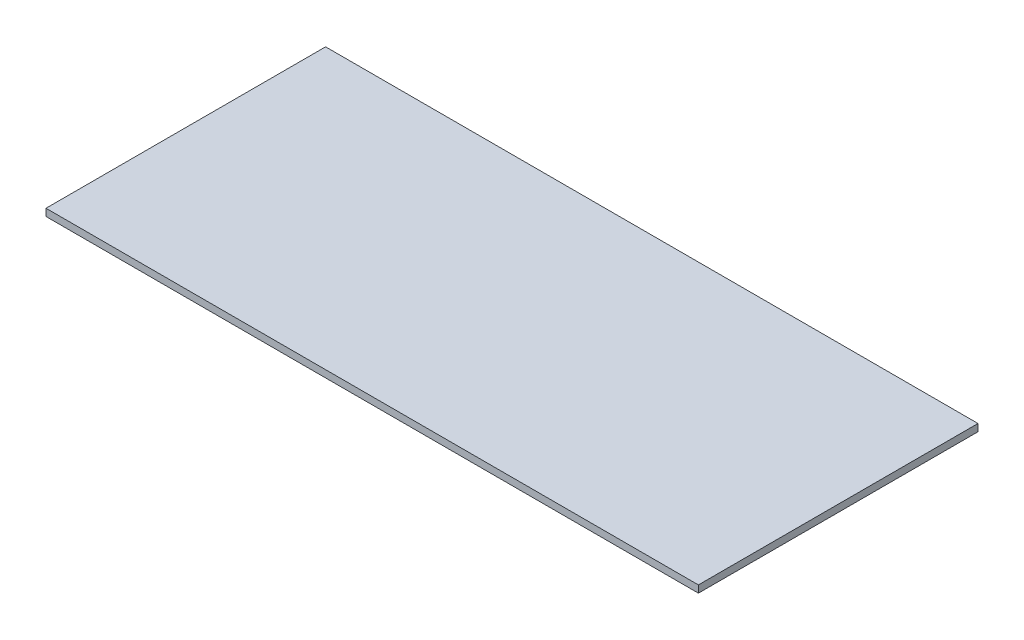
ISO-10303-21;
HEADER;
FILE_DESCRIPTION(('STEP AP214'),'2;1');
FILE_NAME('part.step','',(''),(''),'','','');
FILE_SCHEMA(('AUTOMOTIVE_DESIGN { 1 0 10303 214 1 1 1 1 }'));
ENDSEC;
DATA;
#1=APPLICATION_CONTEXT('core data for automotive mechanical design processes');
#2=APPLICATION_PROTOCOL_DEFINITION('international standard','automotive_design',2000,#1);
#3=PRODUCT_CONTEXT('',#1,'mechanical');
#4=PRODUCT('Part','Part','',(#3));
#5=PRODUCT_RELATED_PRODUCT_CATEGORY('part','',(#4));
#6=PRODUCT_DEFINITION_FORMATION('','',#4);
#7=PRODUCT_DEFINITION_CONTEXT('part definition',#1,'design');
#8=PRODUCT_DEFINITION('design','',#6,#7);
#9=PRODUCT_DEFINITION_SHAPE('','',#8);
#10=(LENGTH_UNIT() NAMED_UNIT(*) SI_UNIT(.MILLI.,.METRE.));
#11=(NAMED_UNIT(*) PLANE_ANGLE_UNIT() SI_UNIT($,.RADIAN.));
#12=(NAMED_UNIT(*) SI_UNIT($,.STERADIAN.) SOLID_ANGLE_UNIT());
#13=UNCERTAINTY_MEASURE_WITH_UNIT(LENGTH_MEASURE(1.E-05),#10,'distance_accuracy_value','');
#14=(GEOMETRIC_REPRESENTATION_CONTEXT(3) GLOBAL_UNCERTAINTY_ASSIGNED_CONTEXT((#13)) GLOBAL_UNIT_ASSIGNED_CONTEXT((#10,
#11,#12)) REPRESENTATION_CONTEXT('',''));
#15=CARTESIAN_POINT('',(0.,0.,0.));
#16=DIRECTION('',(0.,0.,1.));
#17=DIRECTION('',(1.,0.,0.));
#18=AXIS2_PLACEMENT_3D('',#15,#16,#17);
#19=CARTESIAN_POINT('',(0.,2.,0.));
#20=DIRECTION('',(1.,0.,0.));
#21=DIRECTION('',(0.,0.,-1.));
#22=AXIS2_PLACEMENT_3D('',#19,#20,#21);
#23=PLANE('',#22);
#24=DIRECTION('',(0.,0.,1.));
#25=VECTOR('',#24,1.);
#26=CARTESIAN_POINT('',(0.,0.,0.));
#27=LINE('',#26,#25);
#28=CARTESIAN_POINT('',(0.,0.,-78.));
#29=VERTEX_POINT('',#28);
#30=CARTESIAN_POINT('',(0.,0.,0.));
#31=VERTEX_POINT('',#30);
#32=EDGE_CURVE('E96',#29,#31,#27,.T.);
#33=ORIENTED_EDGE('',*,*,#32,.T.);
#34=DIRECTION('',(0.,-1.,0.));
#35=VECTOR('',#34,1.);
#36=CARTESIAN_POINT('',(0.,2.,0.));
#37=LINE('',#36,#35);
#38=CARTESIAN_POINT('',(0.,2.,0.));
#39=VERTEX_POINT('',#38);
#40=EDGE_CURVE('E11',#39,#31,#37,.T.);
#41=ORIENTED_EDGE('',*,*,#40,.F.);
#42=DIRECTION('',(0.,0.,1.));
#43=VECTOR('',#42,1.);
#44=CARTESIAN_POINT('',(0.,2.,0.));
#45=LINE('',#44,#43);
#46=CARTESIAN_POINT('',(0.,2.,-78.));
#47=VERTEX_POINT('',#46);
#48=EDGE_CURVE('E84',#47,#39,#45,.T.);
#49=ORIENTED_EDGE('',*,*,#48,.F.);
#50=DIRECTION('',(0.,-1.,0.));
#51=VECTOR('',#50,1.);
#52=CARTESIAN_POINT('',(0.,2.,-78.));
#53=LINE('',#52,#51);
#54=EDGE_CURVE('E92',#47,#29,#53,.T.);
#55=ORIENTED_EDGE('',*,*,#54,.T.);
#56=EDGE_LOOP('',(#33,#41,#49,#55));
#57=FACE_BOUND('',#56,.T.);
#58=ADVANCED_FACE('F33',(#57),#23,.F.);
#59=CARTESIAN_POINT('',(0.,2.,0.));
#60=DIRECTION('',(0.,0.,-1.));
#61=DIRECTION('',(-1.,0.,0.));
#62=AXIS2_PLACEMENT_3D('',#59,#60,#61);
#63=PLANE('',#62);
#64=DIRECTION('',(1.,0.,0.));
#65=VECTOR('',#64,1.);
#66=CARTESIAN_POINT('',(0.,0.,0.));
#67=LINE('',#66,#65);
#68=CARTESIAN_POINT('',(182.,0.,0.));
#69=VERTEX_POINT('',#68);
#70=EDGE_CURVE('E88',#31,#69,#67,.T.);
#71=ORIENTED_EDGE('',*,*,#70,.T.);
#72=DIRECTION('',(0.,-1.,0.));
#73=VECTOR('',#72,1.);
#74=CARTESIAN_POINT('',(182.,2.,0.));
#75=LINE('',#74,#73);
#76=CARTESIAN_POINT('',(182.,2.,0.));
#77=VERTEX_POINT('',#76);
#78=EDGE_CURVE('E41',#77,#69,#75,.T.);
#79=ORIENTED_EDGE('',*,*,#78,.F.);
#80=DIRECTION('',(1.,0.,0.));
#81=VECTOR('',#80,1.);
#82=CARTESIAN_POINT('',(0.,2.,0.));
#83=LINE('',#82,#81);
#84=EDGE_CURVE('E79',#39,#77,#83,.T.);
#85=ORIENTED_EDGE('',*,*,#84,.F.);
#86=ORIENTED_EDGE('',*,*,#40,.T.);
#87=EDGE_LOOP('',(#71,#79,#85,#86));
#88=FACE_BOUND('',#87,.T.);
#89=ADVANCED_FACE('F87',(#88),#63,.F.);
#90=CARTESIAN_POINT('',(182.,2.,0.));
#91=DIRECTION('',(-1.,0.,0.));
#92=DIRECTION('',(0.,0.,1.));
#93=AXIS2_PLACEMENT_3D('',#90,#91,#92);
#94=PLANE('',#93);
#95=DIRECTION('',(0.,0.,-1.));
#96=VECTOR('',#95,1.);
#97=CARTESIAN_POINT('',(182.,0.,0.));
#98=LINE('',#97,#96);
#99=CARTESIAN_POINT('',(182.,0.,-78.));
#100=VERTEX_POINT('',#99);
#101=EDGE_CURVE('E66',#69,#100,#98,.T.);
#102=ORIENTED_EDGE('',*,*,#101,.T.);
#103=DIRECTION('',(0.,-1.,0.));
#104=VECTOR('',#103,1.);
#105=CARTESIAN_POINT('',(182.,2.,-78.));
#106=LINE('',#105,#104);
#107=CARTESIAN_POINT('',(182.,2.,-78.));
#108=VERTEX_POINT('',#107);
#109=EDGE_CURVE('E89',#108,#100,#106,.T.);
#110=ORIENTED_EDGE('',*,*,#109,.F.);
#111=DIRECTION('',(0.,0.,-1.));
#112=VECTOR('',#111,1.);
#113=CARTESIAN_POINT('',(182.,2.,0.));
#114=LINE('',#113,#112);
#115=EDGE_CURVE('E82',#77,#108,#114,.T.);
#116=ORIENTED_EDGE('',*,*,#115,.F.);
#117=ORIENTED_EDGE('',*,*,#78,.T.);
#118=EDGE_LOOP('',(#102,#110,#116,#117));
#119=FACE_BOUND('',#118,.T.);
#120=ADVANCED_FACE('F90',(#119),#94,.F.);
#121=CARTESIAN_POINT('',(0.,2.,-78.));
#122=DIRECTION('',(0.,0.,1.));
#123=DIRECTION('',(1.,0.,0.));
#124=AXIS2_PLACEMENT_3D('',#121,#122,#123);
#125=PLANE('',#124);
#126=DIRECTION('',(-1.,0.,0.));
#127=VECTOR('',#126,1.);
#128=CARTESIAN_POINT('',(0.,0.,-78.));
#129=LINE('',#128,#127);
#130=EDGE_CURVE('E72',#100,#29,#129,.T.);
#131=ORIENTED_EDGE('',*,*,#130,.T.);
#132=ORIENTED_EDGE('',*,*,#54,.F.);
#133=DIRECTION('',(-1.,0.,0.));
#134=VECTOR('',#133,1.);
#135=CARTESIAN_POINT('',(0.,2.,-78.));
#136=LINE('',#135,#134);
#137=EDGE_CURVE('E49',#108,#47,#136,.T.);
#138=ORIENTED_EDGE('',*,*,#137,.F.);
#139=ORIENTED_EDGE('',*,*,#109,.T.);
#140=EDGE_LOOP('',(#131,#132,#138,#139));
#141=FACE_BOUND('',#140,.T.);
#142=ADVANCED_FACE('F103',(#141),#125,.F.);
#143=CARTESIAN_POINT('',(0.,2.,0.));
#144=DIRECTION('',(0.,-1.,0.));
#145=DIRECTION('',(0.,0.,-1.));
#146=AXIS2_PLACEMENT_3D('',#143,#144,#145);
#147=PLANE('',#146);
#148=ORIENTED_EDGE('',*,*,#48,.T.);
#149=ORIENTED_EDGE('',*,*,#84,.T.);
#150=ORIENTED_EDGE('',*,*,#115,.T.);
#151=ORIENTED_EDGE('',*,*,#137,.T.);
#152=EDGE_LOOP('',(#148,#149,#150,#151));
#153=FACE_BOUND('',#152,.T.);
#154=ADVANCED_FACE('F80',(#153),#147,.F.);
#155=CARTESIAN_POINT('',(0.,0.,0.));
#156=DIRECTION('',(0.,-1.,0.));
#157=DIRECTION('',(0.,0.,-1.));
#158=AXIS2_PLACEMENT_3D('',#155,#156,#157);
#159=PLANE('',#158);
#160=ORIENTED_EDGE('',*,*,#32,.F.);
#161=ORIENTED_EDGE('',*,*,#130,.F.);
#162=ORIENTED_EDGE('',*,*,#101,.F.);
#163=ORIENTED_EDGE('',*,*,#70,.F.);
#164=EDGE_LOOP('',(#160,#161,#162,#163));
#165=FACE_BOUND('',#164,.T.);
#166=ADVANCED_FACE('F106',(#165),#159,.T.);
#167=CLOSED_SHELL('',(#58,#89,#120,#142,#154,#166));
#168=MANIFOLD_SOLID_BREP('B2',#167);
#169=ADVANCED_BREP_SHAPE_REPRESENTATION('',(#18,#168),#14);
#170=SHAPE_DEFINITION_REPRESENTATION(#9,#169);
ENDSEC;
END-ISO-10303-21;
